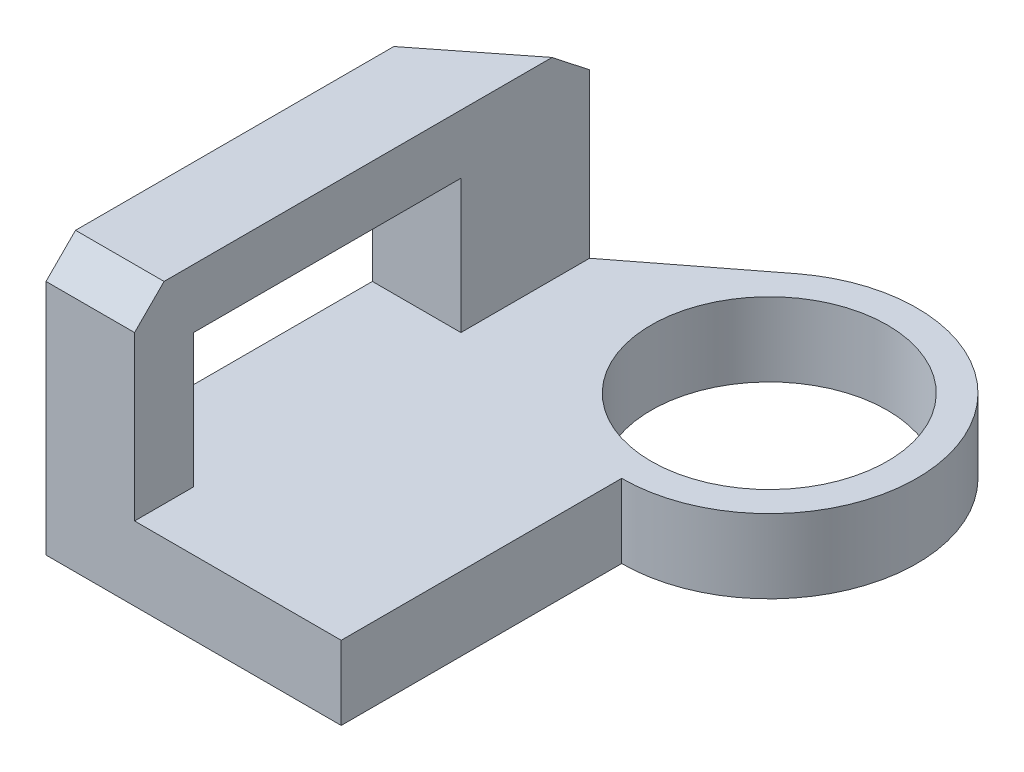
ISO-10303-21;
HEADER;
FILE_DESCRIPTION(('STEP AP214'),'2;1');
FILE_NAME('part.step','',(''),(''),'','','');
FILE_SCHEMA(('AUTOMOTIVE_DESIGN { 1 0 10303 214 1 1 1 1 }'));
ENDSEC;
DATA;
#1=APPLICATION_CONTEXT('core data for automotive mechanical design processes');
#2=APPLICATION_PROTOCOL_DEFINITION('international standard','automotive_design',2000,#1);
#3=PRODUCT_CONTEXT('',#1,'mechanical');
#4=PRODUCT('Part','Part','',(#3));
#5=PRODUCT_RELATED_PRODUCT_CATEGORY('part','',(#4));
#6=PRODUCT_DEFINITION_FORMATION('','',#4);
#7=PRODUCT_DEFINITION_CONTEXT('part definition',#1,'design');
#8=PRODUCT_DEFINITION('design','',#6,#7);
#9=PRODUCT_DEFINITION_SHAPE('','',#8);
#10=(LENGTH_UNIT() NAMED_UNIT(*) SI_UNIT(.MILLI.,.METRE.));
#11=(NAMED_UNIT(*) PLANE_ANGLE_UNIT() SI_UNIT($,.RADIAN.));
#12=(NAMED_UNIT(*) SI_UNIT($,.STERADIAN.) SOLID_ANGLE_UNIT());
#13=UNCERTAINTY_MEASURE_WITH_UNIT(LENGTH_MEASURE(1.E-05),#10,'distance_accuracy_value','');
#14=(GEOMETRIC_REPRESENTATION_CONTEXT(3) GLOBAL_UNCERTAINTY_ASSIGNED_CONTEXT((#13)) GLOBAL_UNIT_ASSIGNED_CONTEXT((#10,
#11,#12)) REPRESENTATION_CONTEXT('',''));
#15=CARTESIAN_POINT('',(0.,0.,0.));
#16=DIRECTION('',(0.,0.,1.));
#17=DIRECTION('',(1.,0.,0.));
#18=AXIS2_PLACEMENT_3D('',#15,#16,#17);
#19=CARTESIAN_POINT('',(0.,22.93,8.74999999999999));
#20=DIRECTION('',(0.,0.,-1.));
#21=DIRECTION('',(-1.,0.,0.));
#22=AXIS2_PLACEMENT_3D('',#19,#20,#21);
#23=PLANE('',#22);
#24=DIRECTION('',(1.,0.,0.));
#25=VECTOR('',#24,1.);
#26=CARTESIAN_POINT('',(-25.4,17.85,8.74999999999999));
#27=LINE('',#26,#25);
#28=CARTESIAN_POINT('',(-25.4,17.85,8.74999999999999));
#29=VERTEX_POINT('',#28);
#30=CARTESIAN_POINT('',(-17.78,17.85,8.74999999999999));
#31=VERTEX_POINT('',#30);
#32=EDGE_CURVE('E171',#29,#31,#27,.T.);
#33=ORIENTED_EDGE('',*,*,#32,.F.);
#34=DIRECTION('',(0.,-1.,0.));
#35=VECTOR('',#34,1.);
#36=CARTESIAN_POINT('',(-25.4,22.93,8.74999999999999));
#37=LINE('',#36,#35);
#38=CARTESIAN_POINT('',(-25.4,6.35,8.74999999999999));
#39=VERTEX_POINT('',#38);
#40=EDGE_CURVE('E169',#29,#39,#37,.T.);
#41=ORIENTED_EDGE('',*,*,#40,.T.);
#42=DIRECTION('',(1.,0.,0.));
#43=VECTOR('',#42,1.);
#44=CARTESIAN_POINT('',(0.,6.35,8.74999999999999));
#45=LINE('',#44,#43);
#46=CARTESIAN_POINT('',(-17.78,6.35,8.74999999999999));
#47=VERTEX_POINT('',#46);
#48=EDGE_CURVE('E193',#39,#47,#45,.T.);
#49=ORIENTED_EDGE('',*,*,#48,.T.);
#50=DIRECTION('',(0.,-1.,0.));
#51=VECTOR('',#50,1.);
#52=CARTESIAN_POINT('',(-17.78,22.93,8.74999999999999));
#53=LINE('',#52,#51);
#54=EDGE_CURVE('E197',#31,#47,#53,.T.);
#55=ORIENTED_EDGE('',*,*,#54,.F.);
#56=EDGE_LOOP('',(#33,#41,#49,#55));
#57=FACE_BOUND('',#56,.T.);
#58=ADVANCED_FACE('F47',(#57),#23,.F.);
#59=CARTESIAN_POINT('',(0.,22.93,31.75));
#60=DIRECTION('',(0.,0.,1.));
#61=DIRECTION('',(1.,0.,0.));
#62=AXIS2_PLACEMENT_3D('',#59,#60,#61);
#63=PLANE('',#62);
#64=DIRECTION('',(1.,0.,0.));
#65=VECTOR('',#64,1.);
#66=CARTESIAN_POINT('',(-25.4,17.85,31.75));
#67=LINE('',#66,#65);
#68=CARTESIAN_POINT('',(-25.4,17.85,31.75));
#69=VERTEX_POINT('',#68);
#70=CARTESIAN_POINT('',(-17.78,17.85,31.75));
#71=VERTEX_POINT('',#70);
#72=EDGE_CURVE('E149',#69,#71,#67,.T.);
#73=ORIENTED_EDGE('',*,*,#72,.T.);
#74=DIRECTION('',(0.,-1.,0.));
#75=VECTOR('',#74,1.);
#76=CARTESIAN_POINT('',(-17.78,22.93,31.75));
#77=LINE('',#76,#75);
#78=CARTESIAN_POINT('',(-17.78,6.35,31.75));
#79=VERTEX_POINT('',#78);
#80=EDGE_CURVE('E178',#71,#79,#77,.T.);
#81=ORIENTED_EDGE('',*,*,#80,.T.);
#82=DIRECTION('',(-1.,0.,0.));
#83=VECTOR('',#82,1.);
#84=CARTESIAN_POINT('',(0.,6.35,31.75));
#85=LINE('',#84,#83);
#86=CARTESIAN_POINT('',(-25.4,6.35,31.75));
#87=VERTEX_POINT('',#86);
#88=EDGE_CURVE('E176',#79,#87,#85,.T.);
#89=ORIENTED_EDGE('',*,*,#88,.T.);
#90=DIRECTION('',(0.,-1.,0.));
#91=VECTOR('',#90,1.);
#92=CARTESIAN_POINT('',(-25.4,22.93,31.75));
#93=LINE('',#92,#91);
#94=EDGE_CURVE('E167',#69,#87,#93,.T.);
#95=ORIENTED_EDGE('',*,*,#94,.F.);
#96=EDGE_LOOP('',(#73,#81,#89,#95));
#97=FACE_BOUND('',#96,.T.);
#98=ADVANCED_FACE('F174',(#97),#63,.F.);
#99=CARTESIAN_POINT('',(0.,6.35,0.));
#100=DIRECTION('',(0.,1.,0.));
#101=DIRECTION('',(0.,0.,1.));
#102=AXIS2_PLACEMENT_3D('',#99,#100,#101);
#103=PLANE('',#102);
#104=DIRECTION('',(0.,0.,1.));
#105=VECTOR('',#104,1.);
#106=CARTESIAN_POINT('',(-17.78,6.35,0.));
#107=LINE('',#106,#105);
#108=CARTESIAN_POINT('',(-17.78,6.35,36.83));
#109=VERTEX_POINT('',#108);
#110=EDGE_CURVE('E160',#79,#109,#107,.T.);
#111=ORIENTED_EDGE('',*,*,#110,.T.);
#112=DIRECTION('',(1.,0.,0.));
#113=VECTOR('',#112,1.);
#114=CARTESIAN_POINT('',(0.,6.35,36.83));
#115=LINE('',#114,#113);
#116=CARTESIAN_POINT('',(0.,6.35,36.83));
#117=VERTEX_POINT('',#116);
#118=EDGE_CURVE('E242',#109,#117,#115,.T.);
#119=ORIENTED_EDGE('',*,*,#118,.T.);
#120=DIRECTION('',(0.,0.,1.));
#121=VECTOR('',#120,1.);
#122=CARTESIAN_POINT('',(0.,6.35,0.));
#123=LINE('',#122,#121);
#124=CARTESIAN_POINT('',(0.,6.35,12.7));
#125=VERTEX_POINT('',#124);
#126=EDGE_CURVE('E223',#125,#117,#123,.T.);
#127=ORIENTED_EDGE('',*,*,#126,.F.);
#128=CARTESIAN_POINT('',(0.,6.35,0.));
#129=DIRECTION('',(0.,1.,0.));
#130=DIRECTION('',(0.,0.,1.));
#131=AXIS2_PLACEMENT_3D('',#128,#129,#130);
#132=CIRCLE('',#131,12.7);
#133=CARTESIAN_POINT('',(-7.75773182780079,6.35,-10.0552273414342));
#134=VERTEX_POINT('',#133);
#135=EDGE_CURVE('E228',#125,#134,#132,.T.);
#136=ORIENTED_EDGE('',*,*,#135,.T.);
#137=DIRECTION('',(0.7917501843649,0.,-0.610845025811086));
#138=VECTOR('',#137,1.);
#139=CARTESIAN_POINT('',(-7.7577318278008,6.35,-10.0552273414342));
#140=LINE('',#139,#138);
#141=CARTESIAN_POINT('',(-17.7799999999999,6.35,-2.32292391893059));
#142=VERTEX_POINT('',#141);
#143=EDGE_CURVE('E232',#142,#134,#140,.T.);
#144=ORIENTED_EDGE('',*,*,#143,.F.);
#145=DIRECTION('',(0.,0.,-1.));
#146=VECTOR('',#145,1.);
#147=CARTESIAN_POINT('',(-17.78,6.35,0.));
#148=LINE('',#147,#146);
#149=EDGE_CURVE('E183',#47,#142,#148,.T.);
#150=ORIENTED_EDGE('',*,*,#149,.F.);
#151=ORIENTED_EDGE('',*,*,#48,.F.);
#152=DIRECTION('',(0.,0.,1.));
#153=VECTOR('',#152,1.);
#154=CARTESIAN_POINT('',(-25.4,6.35,0.));
#155=LINE('',#154,#153);
#156=EDGE_CURVE('E237',#39,#87,#155,.T.);
#157=ORIENTED_EDGE('',*,*,#156,.T.);
#158=ORIENTED_EDGE('',*,*,#88,.F.);
#159=EDGE_LOOP('',(#111,#119,#127,#136,#144,#150,#151,#157,#158));
#160=FACE_BOUND('',#159,.T.);
#161=CARTESIAN_POINT('',(0.,6.35,0.));
#162=DIRECTION('',(0.,1.,0.));
#163=DIRECTION('',(0.,0.,1.));
#164=AXIS2_PLACEMENT_3D('',#161,#162,#163);
#165=CIRCLE('',#164,10.16);
#166=CARTESIAN_POINT('',(0.,6.35,10.16));
#167=VERTEX_POINT('',#166);
#168=EDGE_CURVE('E219',#167,#167,#165,.T.);
#169=ORIENTED_EDGE('',*,*,#168,.F.);
#170=EDGE_LOOP('',(#169));
#171=FACE_BOUND('',#170,.T.);
#172=ADVANCED_FACE('F319',(#160,#171),#103,.T.);
#173=CARTESIAN_POINT('',(0.,6.35,0.));
#174=DIRECTION('',(1.,0.,0.));
#175=DIRECTION('',(0.,0.,-1.));
#176=AXIS2_PLACEMENT_3D('',#173,#174,#175);
#177=PLANE('',#176);
#178=DIRECTION('',(0.,0.,1.));
#179=VECTOR('',#178,1.);
#180=CARTESIAN_POINT('',(0.,0.,0.));
#181=LINE('',#180,#179);
#182=CARTESIAN_POINT('',(0.,0.,12.7));
#183=VERTEX_POINT('',#182);
#184=CARTESIAN_POINT('',(0.,0.,36.83));
#185=VERTEX_POINT('',#184);
#186=EDGE_CURVE('E249',#183,#185,#181,.T.);
#187=ORIENTED_EDGE('',*,*,#186,.F.);
#188=DIRECTION('',(0.,-1.,0.));
#189=VECTOR('',#188,1.);
#190=CARTESIAN_POINT('',(0.,6.35,12.7));
#191=LINE('',#190,#189);
#192=EDGE_CURVE('E279',#125,#183,#191,.T.);
#193=ORIENTED_EDGE('',*,*,#192,.F.);
#194=ORIENTED_EDGE('',*,*,#126,.T.);
#195=DIRECTION('',(0.,-1.,0.));
#196=VECTOR('',#195,1.);
#197=CARTESIAN_POINT('',(0.,6.35,36.83));
#198=LINE('',#197,#196);
#199=EDGE_CURVE('E245',#117,#185,#198,.T.);
#200=ORIENTED_EDGE('',*,*,#199,.T.);
#201=EDGE_LOOP('',(#187,#193,#194,#200));
#202=FACE_BOUND('',#201,.T.);
#203=ADVANCED_FACE('F347',(#202),#177,.T.);
#204=CARTESIAN_POINT('',(0.,6.35,0.));
#205=DIRECTION('',(0.,-1.,0.));
#206=DIRECTION('',(0.,0.,-1.));
#207=AXIS2_PLACEMENT_3D('',#204,#205,#206);
#208=CYLINDRICAL_SURFACE('',#207,12.7);
#209=CARTESIAN_POINT('',(0.,0.,0.));
#210=DIRECTION('',(0.,1.,0.));
#211=DIRECTION('',(0.,0.,1.));
#212=AXIS2_PLACEMENT_3D('',#209,#210,#211);
#213=CIRCLE('',#212,12.7);
#214=CARTESIAN_POINT('',(-7.75773182780079,0.,-10.0552273414342));
#215=VERTEX_POINT('',#214);
#216=EDGE_CURVE('E253',#183,#215,#213,.T.);
#217=ORIENTED_EDGE('',*,*,#216,.T.);
#218=DIRECTION('',(0.,-1.,0.));
#219=VECTOR('',#218,1.);
#220=CARTESIAN_POINT('',(-7.75773182780079,6.35,-10.0552273414342));
#221=LINE('',#220,#219);
#222=EDGE_CURVE('E276',#134,#215,#221,.T.);
#223=ORIENTED_EDGE('',*,*,#222,.F.);
#224=ORIENTED_EDGE('',*,*,#135,.F.);
#225=ORIENTED_EDGE('',*,*,#192,.T.);
#226=EDGE_LOOP('',(#217,#223,#224,#225));
#227=FACE_BOUND('',#226,.T.);
#228=ADVANCED_FACE('F350',(#227),#208,.T.);
#229=CARTESIAN_POINT('',(-7.7577318278008,6.35,-10.0552273414342));
#230=DIRECTION('',(-0.610845025811086,0.,-0.7917501843649));
#231=DIRECTION('',(-0.7917501843649,0.,0.610845025811086));
#232=AXIS2_PLACEMENT_3D('',#229,#230,#231);
#233=PLANE('',#232);
#234=DIRECTION('',(0.7917501843649,0.,-0.610845025811086));
#235=VECTOR('',#234,1.);
#236=CARTESIAN_POINT('',(-7.7577318278008,0.,-10.0552273414342));
#237=LINE('',#236,#235);
#238=CARTESIAN_POINT('',(-25.4,0.,3.556));
#239=VERTEX_POINT('',#238);
#240=EDGE_CURVE('E257',#239,#215,#237,.T.);
#241=ORIENTED_EDGE('',*,*,#240,.F.);
#242=DIRECTION('',(0.,-1.,0.));
#243=VECTOR('',#242,1.);
#244=CARTESIAN_POINT('',(-25.4,6.35,3.556));
#245=LINE('',#244,#243);
#246=CARTESIAN_POINT('',(-25.4,6.35,3.556));
#247=VERTEX_POINT('',#246);
#248=EDGE_CURVE('E273',#247,#239,#245,.T.);
#249=ORIENTED_EDGE('',*,*,#248,.F.);
#250=EDGE_CURVE('E233',#247,#142,#140,.T.);
#251=ORIENTED_EDGE('',*,*,#250,.T.);
#252=ORIENTED_EDGE('',*,*,#143,.T.);
#253=ORIENTED_EDGE('',*,*,#222,.T.);
#254=EDGE_LOOP('',(#241,#249,#251,#252,#253));
#255=FACE_BOUND('',#254,.T.);
#256=ADVANCED_FACE('F328',(#255),#233,.T.);
#257=CARTESIAN_POINT('',(-25.4,6.35,0.));
#258=DIRECTION('',(1.,0.,0.));
#259=DIRECTION('',(0.,0.,-1.));
#260=AXIS2_PLACEMENT_3D('',#257,#258,#259);
#261=PLANE('',#260);
#262=ORIENTED_EDGE('',*,*,#40,.F.);
#263=DIRECTION('',(0.,0.,-1.));
#264=VECTOR('',#263,1.);
#265=CARTESIAN_POINT('',(-25.4,17.85,40.9081002396785));
#266=LINE('',#265,#264);
#267=EDGE_CURVE('E153',#69,#29,#266,.T.);
#268=ORIENTED_EDGE('',*,*,#267,.F.);
#269=ORIENTED_EDGE('',*,*,#94,.T.);
#270=ORIENTED_EDGE('',*,*,#156,.F.);
#271=EDGE_LOOP('',(#262,#268,#269,#270));
#272=FACE_BOUND('',#271,.T.);
#273=DIRECTION('',(0.,0.,1.));
#274=VECTOR('',#273,1.);
#275=CARTESIAN_POINT('',(-25.4,22.93,0.));
#276=LINE('',#275,#274);
#277=CARTESIAN_POINT('',(-25.4,22.93,6.90143478793502));
#278=VERTEX_POINT('',#277);
#279=CARTESIAN_POINT('',(-25.4,22.93,34.29));
#280=VERTEX_POINT('',#279);
#281=EDGE_CURVE('E192',#278,#280,#276,.T.);
#282=ORIENTED_EDGE('',*,*,#281,.F.);
#283=DIRECTION('',(0.,-0.617974305179887,-0.786198294412698));
#284=VECTOR('',#283,1.);
#285=CARTESIAN_POINT('',(-25.4,15.6521120196815,-2.35762836257493));
#286=LINE('',#285,#284);
#287=CARTESIAN_POINT('',(-25.4,20.39,3.66999999999999));
#288=VERTEX_POINT('',#287);
#289=EDGE_CURVE('E293',#278,#288,#286,.T.);
#290=ORIENTED_EDGE('',*,*,#289,.T.);
#291=DIRECTION('',(0.,-1.,0.));
#292=VECTOR('',#291,1.);
#293=CARTESIAN_POINT('',(-25.4,22.93,3.66999999999999));
#294=LINE('',#293,#292);
#295=CARTESIAN_POINT('',(-25.4,6.35,3.66999999999999));
#296=VERTEX_POINT('',#295);
#297=EDGE_CURVE('E212',#288,#296,#294,.T.);
#298=ORIENTED_EDGE('',*,*,#297,.T.);
#299=EDGE_CURVE('E238',#247,#296,#155,.T.);
#300=ORIENTED_EDGE('',*,*,#299,.F.);
#301=ORIENTED_EDGE('',*,*,#248,.T.);
#302=DIRECTION('',(0.,0.,1.));
#303=VECTOR('',#302,1.);
#304=CARTESIAN_POINT('',(-25.4,0.,0.));
#305=LINE('',#304,#303);
#306=CARTESIAN_POINT('',(-25.4,0.,36.83));
#307=VERTEX_POINT('',#306);
#308=EDGE_CURVE('E261',#239,#307,#305,.T.);
#309=ORIENTED_EDGE('',*,*,#308,.T.);
#310=DIRECTION('',(0.,-1.,0.));
#311=VECTOR('',#310,1.);
#312=CARTESIAN_POINT('',(-25.4,6.35,36.83));
#313=LINE('',#312,#311);
#314=CARTESIAN_POINT('',(-25.4,20.39,36.83));
#315=VERTEX_POINT('',#314);
#316=EDGE_CURVE('E270',#315,#307,#313,.T.);
#317=ORIENTED_EDGE('',*,*,#316,.F.);
#318=DIRECTION('',(0.,0.707106781186548,-0.707106781186547));
#319=VECTOR('',#318,1.);
#320=CARTESIAN_POINT('',(-25.4,22.93,34.29));
#321=LINE('',#320,#319);
#322=EDGE_CURVE('E290',#315,#280,#321,.T.);
#323=ORIENTED_EDGE('',*,*,#322,.T.);
#324=EDGE_LOOP('',(#282,#290,#298,#300,#301,#309,#317,#323));
#325=FACE_BOUND('',#324,.T.);
#326=ADVANCED_FACE('F164',(#272,#325),#261,.F.);
#327=CARTESIAN_POINT('',(0.,6.35,0.));
#328=DIRECTION('',(0.,-1.,0.));
#329=DIRECTION('',(0.,0.,-1.));
#330=AXIS2_PLACEMENT_3D('',#327,#328,#329);
#331=CYLINDRICAL_SURFACE('',#330,10.16);
#332=ORIENTED_EDGE('',*,*,#168,.T.);
#333=EDGE_LOOP('',(#332));
#334=FACE_BOUND('',#333,.T.);
#335=CARTESIAN_POINT('',(0.,0.,0.));
#336=DIRECTION('',(0.,1.,0.));
#337=DIRECTION('',(0.,0.,1.));
#338=AXIS2_PLACEMENT_3D('',#335,#336,#337);
#339=CIRCLE('',#338,10.16);
#340=CARTESIAN_POINT('',(0.,0.,10.16));
#341=VERTEX_POINT('',#340);
#342=EDGE_CURVE('E218',#341,#341,#339,.T.);
#343=ORIENTED_EDGE('',*,*,#342,.F.);
#344=EDGE_LOOP('',(#343));
#345=FACE_BOUND('',#344,.T.);
#346=ADVANCED_FACE('F381',(#334,#345),#331,.F.);
#347=CARTESIAN_POINT('',(0.,6.35,36.83));
#348=DIRECTION('',(0.,0.,-1.));
#349=DIRECTION('',(-1.,0.,0.));
#350=AXIS2_PLACEMENT_3D('',#347,#348,#349);
#351=PLANE('',#350);
#352=DIRECTION('',(0.,-1.,0.));
#353=VECTOR('',#352,1.);
#354=CARTESIAN_POINT('',(-17.78,22.93,36.83));
#355=LINE('',#354,#353);
#356=CARTESIAN_POINT('',(-17.78,20.39,36.83));
#357=VERTEX_POINT('',#356);
#358=EDGE_CURVE('E179',#357,#109,#355,.T.);
#359=ORIENTED_EDGE('',*,*,#358,.F.);
#360=DIRECTION('',(-1.,0.,0.));
#361=VECTOR('',#360,1.);
#362=CARTESIAN_POINT('',(-25.4,20.39,36.83));
#363=LINE('',#362,#361);
#364=EDGE_CURVE('E11',#357,#315,#363,.T.);
#365=ORIENTED_EDGE('',*,*,#364,.T.);
#366=ORIENTED_EDGE('',*,*,#316,.T.);
#367=DIRECTION('',(1.,0.,0.));
#368=VECTOR('',#367,1.);
#369=CARTESIAN_POINT('',(0.,0.,36.83));
#370=LINE('',#369,#368);
#371=EDGE_CURVE('E224',#307,#185,#370,.T.);
#372=ORIENTED_EDGE('',*,*,#371,.T.);
#373=ORIENTED_EDGE('',*,*,#199,.F.);
#374=ORIENTED_EDGE('',*,*,#118,.F.);
#375=EDGE_LOOP('',(#359,#365,#366,#372,#373,#374));
#376=FACE_BOUND('',#375,.T.);
#377=ADVANCED_FACE('F344',(#376),#351,.F.);
#378=DIRECTION('',(-0.786028549758584,0.,0.618190196431824));
#379=VECTOR('',#378,1.);
#380=CARTESIAN_POINT('',(-7.92353304477125,6.35,-10.0747686134369));
#381=LINE('',#380,#379);
#382=EDGE_CURVE('E201',#142,#296,#381,.T.);
#383=ORIENTED_EDGE('',*,*,#382,.F.);
#384=ORIENTED_EDGE('',*,*,#250,.F.);
#385=ORIENTED_EDGE('',*,*,#299,.T.);
#386=EDGE_LOOP('',(#383,#384,#385));
#387=FACE_BOUND('',#386,.T.);
#388=ADVANCED_FACE('F315',(#387),#103,.T.);
#389=CARTESIAN_POINT('',(0.,0.,0.));
#390=DIRECTION('',(0.,1.,0.));
#391=DIRECTION('',(0.,0.,1.));
#392=AXIS2_PLACEMENT_3D('',#389,#390,#391);
#393=PLANE('',#392);
#394=ORIENTED_EDGE('',*,*,#342,.T.);
#395=EDGE_LOOP('',(#394));
#396=FACE_BOUND('',#395,.T.);
#397=ORIENTED_EDGE('',*,*,#186,.T.);
#398=ORIENTED_EDGE('',*,*,#371,.F.);
#399=ORIENTED_EDGE('',*,*,#308,.F.);
#400=ORIENTED_EDGE('',*,*,#240,.T.);
#401=ORIENTED_EDGE('',*,*,#216,.F.);
#402=EDGE_LOOP('',(#397,#398,#399,#400,#401));
#403=FACE_BOUND('',#402,.T.);
#404=ADVANCED_FACE('F353',(#396,#403),#393,.F.);
#405=CARTESIAN_POINT('',(-17.78,22.93,0.));
#406=DIRECTION('',(-1.,0.,0.));
#407=DIRECTION('',(0.,0.,1.));
#408=AXIS2_PLACEMENT_3D('',#405,#406,#407);
#409=PLANE('',#408);
#410=DIRECTION('',(0.,-1.,0.));
#411=VECTOR('',#410,1.);
#412=CARTESIAN_POINT('',(-17.78,22.93,-2.32292391893054));
#413=LINE('',#412,#411);
#414=CARTESIAN_POINT('',(-17.78,20.39,-2.32292391893054));
#415=VERTEX_POINT('',#414);
#416=EDGE_CURVE('E215',#415,#142,#413,.T.);
#417=ORIENTED_EDGE('',*,*,#416,.F.);
#418=DIRECTION('',(0.,0.617974305179887,0.786198294412698));
#419=VECTOR('',#418,1.);
#420=CARTESIAN_POINT('',(-17.78,18.5637761715944,-4.6462795132871));
#421=LINE('',#420,#419);
#422=CARTESIAN_POINT('',(-17.78,22.93,0.908510869004483));
#423=VERTEX_POINT('',#422);
#424=EDGE_CURVE('E57',#415,#423,#421,.T.);
#425=ORIENTED_EDGE('',*,*,#424,.T.);
#426=DIRECTION('',(0.,0.,-1.));
#427=VECTOR('',#426,1.);
#428=CARTESIAN_POINT('',(-17.78,22.93,0.));
#429=LINE('',#428,#427);
#430=CARTESIAN_POINT('',(-17.78,22.93,34.29));
#431=VERTEX_POINT('',#430);
#432=EDGE_CURVE('E188',#431,#423,#429,.T.);
#433=ORIENTED_EDGE('',*,*,#432,.F.);
#434=DIRECTION('',(0.,-0.707106781186548,0.707106781186547));
#435=VECTOR('',#434,1.);
#436=CARTESIAN_POINT('',(-17.78,22.93,34.29));
#437=LINE('',#436,#435);
#438=EDGE_CURVE('E64',#431,#357,#437,.T.);
#439=ORIENTED_EDGE('',*,*,#438,.T.);
#440=ORIENTED_EDGE('',*,*,#358,.T.);
#441=ORIENTED_EDGE('',*,*,#110,.F.);
#442=ORIENTED_EDGE('',*,*,#80,.F.);
#443=DIRECTION('',(0.,0.,-1.));
#444=VECTOR('',#443,1.);
#445=CARTESIAN_POINT('',(-17.78,17.85,40.9081002396785));
#446=LINE('',#445,#444);
#447=EDGE_CURVE('E155',#71,#31,#446,.T.);
#448=ORIENTED_EDGE('',*,*,#447,.T.);
#449=ORIENTED_EDGE('',*,*,#54,.T.);
#450=ORIENTED_EDGE('',*,*,#149,.T.);
#451=EDGE_LOOP('',(#417,#425,#433,#439,#440,#441,#442,#448,#449,#450));
#452=FACE_BOUND('',#451,.T.);
#453=ADVANCED_FACE('F301',(#452),#409,.F.);
#454=CARTESIAN_POINT('',(-7.92353304477125,22.93,-10.0747686134369));
#455=DIRECTION('',(0.618190196431824,0.,0.786028549758584));
#456=DIRECTION('',(0.786028549758584,0.,-0.618190196431824));
#457=AXIS2_PLACEMENT_3D('',#454,#455,#456);
#458=PLANE('',#457);
#459=ORIENTED_EDGE('',*,*,#297,.F.);
#460=DIRECTION('',(0.786028549758584,0.,-0.618190196431824));
#461=VECTOR('',#460,1.);
#462=CARTESIAN_POINT('',(-17.78,20.39,-2.32292391893054));
#463=LINE('',#462,#461);
#464=EDGE_CURVE('E72',#288,#415,#463,.T.);
#465=ORIENTED_EDGE('',*,*,#464,.T.);
#466=ORIENTED_EDGE('',*,*,#416,.T.);
#467=ORIENTED_EDGE('',*,*,#382,.T.);
#468=EDGE_LOOP('',(#459,#465,#466,#467));
#469=FACE_BOUND('',#468,.T.);
#470=ADVANCED_FACE('F310',(#469),#458,.F.);
#471=CARTESIAN_POINT('',(0.,22.93,0.));
#472=DIRECTION('',(0.,1.,0.));
#473=DIRECTION('',(0.,0.,1.));
#474=AXIS2_PLACEMENT_3D('',#471,#472,#473);
#475=PLANE('',#474);
#476=ORIENTED_EDGE('',*,*,#432,.T.);
#477=DIRECTION('',(-0.786028549758584,0.,0.618190196431824));
#478=VECTOR('',#477,1.);
#479=CARTESIAN_POINT('',(-23.8297969010632,22.93,5.6665125163868));
#480=LINE('',#479,#478);
#481=EDGE_CURVE('E286',#423,#278,#480,.T.);
#482=ORIENTED_EDGE('',*,*,#481,.T.);
#483=ORIENTED_EDGE('',*,*,#281,.T.);
#484=DIRECTION('',(1.,0.,0.));
#485=VECTOR('',#484,1.);
#486=CARTESIAN_POINT('',(-17.78,22.93,34.29));
#487=LINE('',#486,#485);
#488=EDGE_CURVE('E282',#280,#431,#487,.T.);
#489=ORIENTED_EDGE('',*,*,#488,.T.);
#490=EDGE_LOOP('',(#476,#482,#483,#489));
#491=FACE_BOUND('',#490,.T.);
#492=ADVANCED_FACE('F305',(#491),#475,.T.);
#493=CARTESIAN_POINT('',(-25.4,17.85,40.9081002396785));
#494=DIRECTION('',(0.,1.,0.));
#495=DIRECTION('',(0.,0.,1.));
#496=AXIS2_PLACEMENT_3D('',#493,#494,#495);
#497=PLANE('',#496);
#498=ORIENTED_EDGE('',*,*,#72,.F.);
#499=ORIENTED_EDGE('',*,*,#267,.T.);
#500=ORIENTED_EDGE('',*,*,#32,.T.);
#501=ORIENTED_EDGE('',*,*,#447,.F.);
#502=EDGE_LOOP('',(#498,#499,#500,#501));
#503=FACE_BOUND('',#502,.T.);
#504=ADVANCED_FACE('F151',(#503),#497,.F.);
#505=CARTESIAN_POINT('',(-6.35332994583441,22.93,-8.07825609705014));
#506=DIRECTION('',(-0.437126479959987,0.707106781186546,-0.555806117740523));
#507=DIRECTION('',(0.786028549758584,0.,-0.618190196431824));
#508=AXIS2_PLACEMENT_3D('',#505,#506,#507);
#509=PLANE('',#508);
#510=ORIENTED_EDGE('',*,*,#424,.F.);
#511=ORIENTED_EDGE('',*,*,#464,.F.);
#512=ORIENTED_EDGE('',*,*,#289,.F.);
#513=ORIENTED_EDGE('',*,*,#481,.F.);
#514=EDGE_LOOP('',(#510,#511,#512,#513));
#515=FACE_BOUND('',#514,.T.);
#516=ADVANCED_FACE('F308',(#515),#509,.T.);
#517=CARTESIAN_POINT('',(0.,22.93,34.29));
#518=DIRECTION('',(0.,0.707106781186547,0.707106781186548));
#519=DIRECTION('',(-1.,0.,0.));
#520=AXIS2_PLACEMENT_3D('',#517,#518,#519);
#521=PLANE('',#520);
#522=ORIENTED_EDGE('',*,*,#322,.F.);
#523=ORIENTED_EDGE('',*,*,#364,.F.);
#524=ORIENTED_EDGE('',*,*,#438,.F.);
#525=ORIENTED_EDGE('',*,*,#488,.F.);
#526=EDGE_LOOP('',(#522,#523,#524,#525));
#527=FACE_BOUND('',#526,.T.);
#528=ADVANCED_FACE('F50',(#527),#521,.T.);
#529=CLOSED_SHELL('',(#58,#98,#172,#203,#228,#256,#326,#346,#377,#388,#404,#453,#470,#492,#504,
#516,#528));
#530=MANIFOLD_SOLID_BREP('B2',#529);
#531=ADVANCED_BREP_SHAPE_REPRESENTATION('',(#18,#530),#14);
#532=SHAPE_DEFINITION_REPRESENTATION(#9,#531);
ENDSEC;
END-ISO-10303-21;
